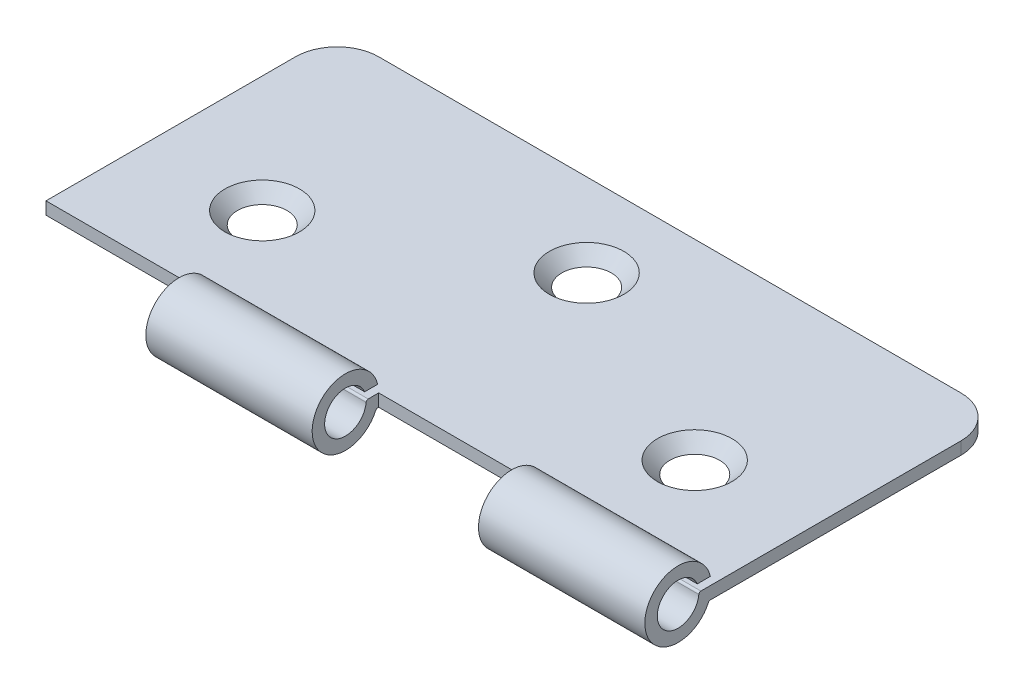
ISO-10303-21;
HEADER;
FILE_DESCRIPTION(('STEP AP214'),'2;1');
FILE_NAME('part.step','',(''),(''),'','','');
FILE_SCHEMA(('AUTOMOTIVE_DESIGN { 1 0 10303 214 1 1 1 1 }'));
ENDSEC;
DATA;
#1=APPLICATION_CONTEXT('core data for automotive mechanical design processes');
#2=APPLICATION_PROTOCOL_DEFINITION('international standard','automotive_design',2000,#1);
#3=PRODUCT_CONTEXT('',#1,'mechanical');
#4=PRODUCT('Part','Part','',(#3));
#5=PRODUCT_RELATED_PRODUCT_CATEGORY('part','',(#4));
#6=PRODUCT_DEFINITION_FORMATION('','',#4);
#7=PRODUCT_DEFINITION_CONTEXT('part definition',#1,'design');
#8=PRODUCT_DEFINITION('design','',#6,#7);
#9=PRODUCT_DEFINITION_SHAPE('','',#8);
#10=(LENGTH_UNIT() NAMED_UNIT(*) SI_UNIT(.MILLI.,.METRE.));
#11=(NAMED_UNIT(*) PLANE_ANGLE_UNIT() SI_UNIT($,.RADIAN.));
#12=(NAMED_UNIT(*) SI_UNIT($,.STERADIAN.) SOLID_ANGLE_UNIT());
#13=UNCERTAINTY_MEASURE_WITH_UNIT(LENGTH_MEASURE(1.E-05),#10,'distance_accuracy_value','');
#14=(GEOMETRIC_REPRESENTATION_CONTEXT(3) GLOBAL_UNCERTAINTY_ASSIGNED_CONTEXT((#13)) GLOBAL_UNIT_ASSIGNED_CONTEXT((#10,
#11,#12)) REPRESENTATION_CONTEXT('',''));
#15=CARTESIAN_POINT('',(0.,0.,0.));
#16=DIRECTION('',(0.,0.,1.));
#17=DIRECTION('',(1.,0.,0.));
#18=AXIS2_PLACEMENT_3D('',#15,#16,#17);
#19=CARTESIAN_POINT('',(-40.,1.5,17.5));
#20=DIRECTION('',(0.,0.,-1.));
#21=DIRECTION('',(-1.,0.,0.));
#22=AXIS2_PLACEMENT_3D('',#19,#20,#21);
#23=PLANE('',#22);
#24=DIRECTION('',(0.,1.,0.));
#25=VECTOR('',#24,1.);
#26=CARTESIAN_POINT('',(-20.,0.,17.5));
#27=LINE('',#26,#25);
#28=CARTESIAN_POINT('',(-20.,0.,17.5));
#29=VERTEX_POINT('',#28);
#30=CARTESIAN_POINT('',(-20.,1.5,17.5));
#31=VERTEX_POINT('',#30);
#32=EDGE_CURVE('E65',#29,#31,#27,.T.);
#33=ORIENTED_EDGE('',*,*,#32,.T.);
#34=DIRECTION('',(1.,0.,0.));
#35=VECTOR('',#34,1.);
#36=CARTESIAN_POINT('',(-40.,1.5,17.5));
#37=LINE('',#36,#35);
#38=CARTESIAN_POINT('',(-40.,1.5,17.5));
#39=VERTEX_POINT('',#38);
#40=EDGE_CURVE('E351',#39,#31,#37,.T.);
#41=ORIENTED_EDGE('',*,*,#40,.F.);
#42=DIRECTION('',(0.,-1.,0.));
#43=VECTOR('',#42,1.);
#44=CARTESIAN_POINT('',(-40.,1.5,17.5));
#45=LINE('',#44,#43);
#46=CARTESIAN_POINT('',(-40.,0.,17.5));
#47=VERTEX_POINT('',#46);
#48=EDGE_CURVE('E11',#39,#47,#45,.T.);
#49=ORIENTED_EDGE('',*,*,#48,.T.);
#50=DIRECTION('',(1.,0.,0.));
#51=VECTOR('',#50,1.);
#52=CARTESIAN_POINT('',(-40.,0.,17.5));
#53=LINE('',#52,#51);
#54=EDGE_CURVE('E371',#47,#29,#53,.T.);
#55=ORIENTED_EDGE('',*,*,#54,.T.);
#56=EDGE_LOOP('',(#33,#41,#49,#55));
#57=FACE_BOUND('',#56,.T.);
#58=ADVANCED_FACE('F39',(#57),#23,.F.);
#59=CARTESIAN_POINT('',(-40.,1.5,17.5));
#60=DIRECTION('',(1.,0.,0.));
#61=DIRECTION('',(0.,0.,-1.));
#62=AXIS2_PLACEMENT_3D('',#59,#60,#61);
#63=PLANE('',#62);
#64=DIRECTION('',(0.,0.,1.));
#65=VECTOR('',#64,1.);
#66=CARTESIAN_POINT('',(-40.,0.,17.5));
#67=LINE('',#66,#65);
#68=CARTESIAN_POINT('',(-40.,0.,-12.5));
#69=VERTEX_POINT('',#68);
#70=EDGE_CURVE('E329',#69,#47,#67,.T.);
#71=ORIENTED_EDGE('',*,*,#70,.T.);
#72=ORIENTED_EDGE('',*,*,#48,.F.);
#73=DIRECTION('',(0.,0.,1.));
#74=VECTOR('',#73,1.);
#75=CARTESIAN_POINT('',(-40.,1.5,17.5));
#76=LINE('',#75,#74);
#77=CARTESIAN_POINT('',(-40.,1.5,-12.5));
#78=VERTEX_POINT('',#77);
#79=EDGE_CURVE('E346',#78,#39,#76,.T.);
#80=ORIENTED_EDGE('',*,*,#79,.F.);
#81=DIRECTION('',(0.,-1.,0.));
#82=VECTOR('',#81,1.);
#83=CARTESIAN_POINT('',(-40.,1.5,-12.5));
#84=LINE('',#83,#82);
#85=EDGE_CURVE('E366',#78,#69,#84,.T.);
#86=ORIENTED_EDGE('',*,*,#85,.T.);
#87=EDGE_LOOP('',(#71,#72,#80,#86));
#88=FACE_BOUND('',#87,.T.);
#89=ADVANCED_FACE('F41',(#88),#63,.F.);
#90=CARTESIAN_POINT('',(0.,1.5,17.5));
#91=VERTEX_POINT('',#90);
#92=CARTESIAN_POINT('',(20.,1.5,17.5));
#93=VERTEX_POINT('',#92);
#94=EDGE_CURVE('E57',#91,#93,#37,.T.);
#95=ORIENTED_EDGE('',*,*,#94,.F.);
#96=DIRECTION('',(0.,1.,0.));
#97=VECTOR('',#96,1.);
#98=CARTESIAN_POINT('',(0.,0.,17.5));
#99=LINE('',#98,#97);
#100=CARTESIAN_POINT('',(0.,0.,17.5));
#101=VERTEX_POINT('',#100);
#102=EDGE_CURVE('E242',#101,#91,#99,.T.);
#103=ORIENTED_EDGE('',*,*,#102,.F.);
#104=CARTESIAN_POINT('',(20.,0.,17.5));
#105=VERTEX_POINT('',#104);
#106=EDGE_CURVE('E370',#101,#105,#53,.T.);
#107=ORIENTED_EDGE('',*,*,#106,.T.);
#108=DIRECTION('',(0.,1.,0.));
#109=VECTOR('',#108,1.);
#110=CARTESIAN_POINT('',(20.,0.,17.5));
#111=LINE('',#110,#109);
#112=EDGE_CURVE('E284',#105,#93,#111,.T.);
#113=ORIENTED_EDGE('',*,*,#112,.T.);
#114=EDGE_LOOP('',(#95,#103,#107,#113));
#115=FACE_BOUND('',#114,.T.);
#116=ADVANCED_FACE('F467',(#115),#23,.F.);
#117=CARTESIAN_POINT('',(40.,1.5,17.5));
#118=DIRECTION('',(-1.,0.,0.));
#119=DIRECTION('',(0.,0.,1.));
#120=AXIS2_PLACEMENT_3D('',#117,#118,#119);
#121=PLANE('',#120);
#122=DIRECTION('',(0.,0.,-1.));
#123=VECTOR('',#122,1.);
#124=CARTESIAN_POINT('',(40.,0.,17.5));
#125=LINE('',#124,#123);
#126=CARTESIAN_POINT('',(40.,0.,17.6270166537926));
#127=VERTEX_POINT('',#126);
#128=CARTESIAN_POINT('',(40.,0.,-12.5));
#129=VERTEX_POINT('',#128);
#130=EDGE_CURVE('E374',#127,#129,#125,.T.);
#131=ORIENTED_EDGE('',*,*,#130,.T.);
#132=DIRECTION('',(0.,-1.,0.));
#133=VECTOR('',#132,1.);
#134=CARTESIAN_POINT('',(40.,1.5,-12.5));
#135=LINE('',#134,#133);
#136=CARTESIAN_POINT('',(40.,1.5,-12.5));
#137=VERTEX_POINT('',#136);
#138=EDGE_CURVE('E49',#137,#129,#135,.T.);
#139=ORIENTED_EDGE('',*,*,#138,.F.);
#140=DIRECTION('',(0.,0.,-1.));
#141=VECTOR('',#140,1.);
#142=CARTESIAN_POINT('',(40.,1.5,17.5));
#143=LINE('',#142,#141);
#144=CARTESIAN_POINT('',(40.,1.5,18.7613872124742));
#145=VERTEX_POINT('',#144);
#146=EDGE_CURVE('E354',#145,#137,#143,.T.);
#147=ORIENTED_EDGE('',*,*,#146,.F.);
#148=CARTESIAN_POINT('',(40.,1.25,18.7613872124742));
#149=DIRECTION('',(1.,0.,0.));
#150=DIRECTION('',(0.,0.,1.));
#151=AXIS2_PLACEMENT_3D('',#148,#149,#150);
#152=CIRCLE('',#151,0.25);
#153=CARTESIAN_POINT('',(40.,1.27272727272727,19.0103520113402));
#154=VERTEX_POINT('',#153);
#155=EDGE_CURVE('E311',#145,#154,#152,.T.);
#156=ORIENTED_EDGE('',*,*,#155,.T.);
#157=CARTESIAN_POINT('',(40.,1.5,21.5));
#158=DIRECTION('',(-1.,0.,0.));
#159=DIRECTION('',(0.,0.,-1.));
#160=AXIS2_PLACEMENT_3D('',#157,#158,#159);
#161=CIRCLE('',#160,2.5);
#162=CARTESIAN_POINT('',(40.,2.45665015011595,19.1902769667592));
#163=VERTEX_POINT('',#162);
#164=EDGE_CURVE('E315',#154,#163,#161,.T.);
#165=ORIENTED_EDGE('',*,*,#164,.T.);
#166=DIRECTION('',(0.,0.,-1.));
#167=VECTOR('',#166,1.);
#168=CARTESIAN_POINT('',(40.,2.45665015011595,17.6160818121022));
#169=LINE('',#168,#167);
#170=CARTESIAN_POINT('',(40.,2.45665015011595,17.6160818121022));
#171=VERTEX_POINT('',#170);
#172=EDGE_CURVE('E319',#163,#171,#169,.T.);
#173=ORIENTED_EDGE('',*,*,#172,.T.);
#174=CARTESIAN_POINT('',(40.,1.5,21.5));
#175=DIRECTION('',(1.,0.,0.));
#176=DIRECTION('',(0.,0.,-1.));
#177=AXIS2_PLACEMENT_3D('',#174,#175,#176);
#178=CIRCLE('',#177,4.);
#179=CARTESIAN_POINT('',(40.,-0.147058823529412,17.8548392035695));
#180=VERTEX_POINT('',#179);
#181=EDGE_CURVE('E280',#171,#180,#178,.T.);
#182=ORIENTED_EDGE('',*,*,#181,.T.);
#183=CARTESIAN_POINT('',(40.,-0.25,17.6270166537926));
#184=DIRECTION('',(-1.,0.,0.));
#185=DIRECTION('',(0.,0.,-1.));
#186=AXIS2_PLACEMENT_3D('',#183,#184,#185);
#187=CIRCLE('',#186,0.25);
#188=EDGE_CURVE('E263',#180,#127,#187,.T.);
#189=ORIENTED_EDGE('',*,*,#188,.T.);
#190=EDGE_LOOP('',(#131,#139,#147,#156,#165,#173,#182,#189));
#191=FACE_BOUND('',#190,.T.);
#192=ADVANCED_FACE('F455',(#191),#121,.F.);
#193=CARTESIAN_POINT('',(35.,1.5,-12.5));
#194=DIRECTION('',(0.,-1.,0.));
#195=DIRECTION('',(0.,0.,-1.));
#196=AXIS2_PLACEMENT_3D('',#193,#194,#195);
#197=CYLINDRICAL_SURFACE('',#196,5.);
#198=CARTESIAN_POINT('',(35.,0.,-12.5));
#199=DIRECTION('',(0.,1.,0.));
#200=DIRECTION('',(0.,0.,-1.));
#201=AXIS2_PLACEMENT_3D('',#198,#199,#200);
#202=CIRCLE('',#201,5.);
#203=CARTESIAN_POINT('',(35.,0.,-17.5));
#204=VERTEX_POINT('',#203);
#205=EDGE_CURVE('E377',#129,#204,#202,.T.);
#206=ORIENTED_EDGE('',*,*,#205,.T.);
#207=DIRECTION('',(0.,-1.,0.));
#208=VECTOR('',#207,1.);
#209=CARTESIAN_POINT('',(35.,1.5,-17.5));
#210=LINE('',#209,#208);
#211=CARTESIAN_POINT('',(35.,1.5,-17.5));
#212=VERTEX_POINT('',#211);
#213=EDGE_CURVE('E392',#212,#204,#210,.T.);
#214=ORIENTED_EDGE('',*,*,#213,.F.);
#215=CARTESIAN_POINT('',(35.,1.5,-12.5));
#216=DIRECTION('',(0.,1.,0.));
#217=DIRECTION('',(0.,0.,-1.));
#218=AXIS2_PLACEMENT_3D('',#215,#216,#217);
#219=CIRCLE('',#218,5.);
#220=EDGE_CURVE('E357',#137,#212,#219,.T.);
#221=ORIENTED_EDGE('',*,*,#220,.F.);
#222=ORIENTED_EDGE('',*,*,#138,.T.);
#223=EDGE_LOOP('',(#206,#214,#221,#222));
#224=FACE_BOUND('',#223,.T.);
#225=ADVANCED_FACE('F447',(#224),#197,.T.);
#226=CARTESIAN_POINT('',(-35.,1.5,-17.5));
#227=DIRECTION('',(0.,0.,1.));
#228=DIRECTION('',(1.,0.,0.));
#229=AXIS2_PLACEMENT_3D('',#226,#227,#228);
#230=PLANE('',#229);
#231=DIRECTION('',(-1.,0.,0.));
#232=VECTOR('',#231,1.);
#233=CARTESIAN_POINT('',(-35.,0.,-17.5));
#234=LINE('',#233,#232);
#235=CARTESIAN_POINT('',(-35.,0.,-17.5));
#236=VERTEX_POINT('',#235);
#237=EDGE_CURVE('E380',#204,#236,#234,.T.);
#238=ORIENTED_EDGE('',*,*,#237,.T.);
#239=DIRECTION('',(0.,-1.,0.));
#240=VECTOR('',#239,1.);
#241=CARTESIAN_POINT('',(-35.,1.5,-17.5));
#242=LINE('',#241,#240);
#243=CARTESIAN_POINT('',(-35.,1.5,-17.5));
#244=VERTEX_POINT('',#243);
#245=EDGE_CURVE('E388',#244,#236,#242,.T.);
#246=ORIENTED_EDGE('',*,*,#245,.F.);
#247=DIRECTION('',(-1.,0.,0.));
#248=VECTOR('',#247,1.);
#249=CARTESIAN_POINT('',(-35.,1.5,-17.5));
#250=LINE('',#249,#248);
#251=EDGE_CURVE('E360',#212,#244,#250,.T.);
#252=ORIENTED_EDGE('',*,*,#251,.F.);
#253=ORIENTED_EDGE('',*,*,#213,.T.);
#254=EDGE_LOOP('',(#238,#246,#252,#253));
#255=FACE_BOUND('',#254,.T.);
#256=ADVANCED_FACE('F443',(#255),#230,.F.);
#257=CARTESIAN_POINT('',(-35.,1.5,-12.5));
#258=DIRECTION('',(0.,-1.,0.));
#259=DIRECTION('',(0.,0.,-1.));
#260=AXIS2_PLACEMENT_3D('',#257,#258,#259);
#261=CYLINDRICAL_SURFACE('',#260,5.);
#262=CARTESIAN_POINT('',(-35.,0.,-12.5));
#263=DIRECTION('',(0.,1.,0.));
#264=DIRECTION('',(0.,0.,1.));
#265=AXIS2_PLACEMENT_3D('',#262,#263,#264);
#266=CIRCLE('',#265,5.);
#267=EDGE_CURVE('E350',#236,#69,#266,.T.);
#268=ORIENTED_EDGE('',*,*,#267,.T.);
#269=ORIENTED_EDGE('',*,*,#85,.F.);
#270=CARTESIAN_POINT('',(-35.,1.5,-12.5));
#271=DIRECTION('',(0.,1.,0.));
#272=DIRECTION('',(0.,0.,1.));
#273=AXIS2_PLACEMENT_3D('',#270,#271,#272);
#274=CIRCLE('',#273,5.);
#275=EDGE_CURVE('E363',#244,#78,#274,.T.);
#276=ORIENTED_EDGE('',*,*,#275,.F.);
#277=ORIENTED_EDGE('',*,*,#245,.T.);
#278=EDGE_LOOP('',(#268,#269,#276,#277));
#279=FACE_BOUND('',#278,.T.);
#280=ADVANCED_FACE('F426',(#279),#261,.T.);
#281=CARTESIAN_POINT('',(-35.,1.5,-12.5));
#282=DIRECTION('',(0.,1.,0.));
#283=DIRECTION('',(0.,0.,1.));
#284=AXIS2_PLACEMENT_3D('',#281,#282,#283);
#285=PLANE('',#284);
#286=CARTESIAN_POINT('',(-26.,1.5,5.5));
#287=DIRECTION('',(0.,1.,0.));
#288=DIRECTION('',(0.,0.,1.));
#289=AXIS2_PLACEMENT_3D('',#286,#287,#288);
#290=CIRCLE('',#289,4.48);
#291=CARTESIAN_POINT('',(-26.,1.5,9.98));
#292=VERTEX_POINT('',#291);
#293=EDGE_CURVE('E414',#292,#292,#290,.T.);
#294=ORIENTED_EDGE('',*,*,#293,.F.);
#295=EDGE_LOOP('',(#294));
#296=FACE_BOUND('',#295,.T.);
#297=CARTESIAN_POINT('',(0.,1.5,-7.5));
#298=DIRECTION('',(0.,1.,0.));
#299=DIRECTION('',(0.,0.,1.));
#300=AXIS2_PLACEMENT_3D('',#297,#298,#299);
#301=CIRCLE('',#300,4.48);
#302=CARTESIAN_POINT('',(0.,1.5,-3.02));
#303=VERTEX_POINT('',#302);
#304=EDGE_CURVE('E402',#303,#303,#301,.T.);
#305=ORIENTED_EDGE('',*,*,#304,.F.);
#306=EDGE_LOOP('',(#305));
#307=FACE_BOUND('',#306,.T.);
#308=CARTESIAN_POINT('',(26.,1.5,5.5));
#309=DIRECTION('',(0.,1.,0.));
#310=DIRECTION('',(0.,0.,1.));
#311=AXIS2_PLACEMENT_3D('',#308,#309,#310);
#312=CIRCLE('',#311,4.48);
#313=CARTESIAN_POINT('',(26.,1.5,9.98));
#314=VERTEX_POINT('',#313);
#315=EDGE_CURVE('E401',#314,#314,#312,.T.);
#316=ORIENTED_EDGE('',*,*,#315,.F.);
#317=EDGE_LOOP('',(#316));
#318=FACE_BOUND('',#317,.T.);
#319=ORIENTED_EDGE('',*,*,#79,.T.);
#320=ORIENTED_EDGE('',*,*,#40,.T.);
#321=DIRECTION('',(0.,0.,1.));
#322=VECTOR('',#321,1.);
#323=CARTESIAN_POINT('',(-20.,1.5,17.5));
#324=LINE('',#323,#322);
#325=CARTESIAN_POINT('',(-20.,1.5,18.7613872124742));
#326=VERTEX_POINT('',#325);
#327=EDGE_CURVE('E219',#31,#326,#324,.T.);
#328=ORIENTED_EDGE('',*,*,#327,.T.);
#329=DIRECTION('',(1.,0.,0.));
#330=VECTOR('',#329,1.);
#331=CARTESIAN_POINT('',(-20.,1.5,18.7613872124742));
#332=LINE('',#331,#330);
#333=CARTESIAN_POINT('',(0.,1.5,18.7613872124742));
#334=VERTEX_POINT('',#333);
#335=EDGE_CURVE('E192',#326,#334,#332,.T.);
#336=ORIENTED_EDGE('',*,*,#335,.T.);
#337=DIRECTION('',(0.,0.,1.));
#338=VECTOR('',#337,1.);
#339=CARTESIAN_POINT('',(0.,1.5,17.5));
#340=LINE('',#339,#338);
#341=EDGE_CURVE('E246',#91,#334,#340,.T.);
#342=ORIENTED_EDGE('',*,*,#341,.F.);
#343=ORIENTED_EDGE('',*,*,#94,.T.);
#344=DIRECTION('',(0.,0.,1.));
#345=VECTOR('',#344,1.);
#346=CARTESIAN_POINT('',(20.,1.5,17.5));
#347=LINE('',#346,#345);
#348=CARTESIAN_POINT('',(20.,1.5,18.7613872124742));
#349=VERTEX_POINT('',#348);
#350=EDGE_CURVE('E287',#93,#349,#347,.T.);
#351=ORIENTED_EDGE('',*,*,#350,.T.);
#352=DIRECTION('',(1.,0.,0.));
#353=VECTOR('',#352,1.);
#354=CARTESIAN_POINT('',(20.,1.5,18.7613872124742));
#355=LINE('',#354,#353);
#356=EDGE_CURVE('E339',#349,#145,#355,.T.);
#357=ORIENTED_EDGE('',*,*,#356,.T.);
#358=ORIENTED_EDGE('',*,*,#146,.T.);
#359=ORIENTED_EDGE('',*,*,#220,.T.);
#360=ORIENTED_EDGE('',*,*,#251,.T.);
#361=ORIENTED_EDGE('',*,*,#275,.T.);
#362=EDGE_LOOP('',(#319,#320,#328,#336,#342,#343,#351,#357,#358,#359,#360,#361));
#363=FACE_BOUND('',#362,.T.);
#364=ADVANCED_FACE('F423',(#296,#307,#318,#363),#285,.T.);
#365=CARTESIAN_POINT('',(-35.,0.,-12.5));
#366=DIRECTION('',(0.,1.,0.));
#367=DIRECTION('',(0.,0.,1.));
#368=AXIS2_PLACEMENT_3D('',#365,#366,#367);
#369=PLANE('',#368);
#370=CARTESIAN_POINT('',(-26.,0.,5.5));
#371=DIRECTION('',(0.,1.,0.));
#372=DIRECTION('',(0.,0.,1.));
#373=AXIS2_PLACEMENT_3D('',#370,#371,#372);
#374=CIRCLE('',#373,2.98);
#375=CARTESIAN_POINT('',(-26.,0.,8.48));
#376=VERTEX_POINT('',#375);
#377=EDGE_CURVE('E43',#376,#376,#374,.T.);
#378=ORIENTED_EDGE('',*,*,#377,.T.);
#379=EDGE_LOOP('',(#378));
#380=FACE_BOUND('',#379,.T.);
#381=CARTESIAN_POINT('',(0.,0.,-7.5));
#382=DIRECTION('',(0.,1.,0.));
#383=DIRECTION('',(0.,0.,1.));
#384=AXIS2_PLACEMENT_3D('',#381,#382,#383);
#385=CIRCLE('',#384,2.98);
#386=CARTESIAN_POINT('',(0.,0.,-4.52));
#387=VERTEX_POINT('',#386);
#388=EDGE_CURVE('E398',#387,#387,#385,.T.);
#389=ORIENTED_EDGE('',*,*,#388,.T.);
#390=EDGE_LOOP('',(#389));
#391=FACE_BOUND('',#390,.T.);
#392=CARTESIAN_POINT('',(26.,0.,5.5));
#393=DIRECTION('',(0.,1.,0.));
#394=DIRECTION('',(0.,0.,1.));
#395=AXIS2_PLACEMENT_3D('',#392,#393,#394);
#396=CIRCLE('',#395,2.98);
#397=CARTESIAN_POINT('',(26.,0.,8.48));
#398=VERTEX_POINT('',#397);
#399=EDGE_CURVE('E214',#398,#398,#396,.T.);
#400=ORIENTED_EDGE('',*,*,#399,.T.);
#401=EDGE_LOOP('',(#400));
#402=FACE_BOUND('',#401,.T.);
#403=ORIENTED_EDGE('',*,*,#70,.F.);
#404=ORIENTED_EDGE('',*,*,#267,.F.);
#405=ORIENTED_EDGE('',*,*,#237,.F.);
#406=ORIENTED_EDGE('',*,*,#205,.F.);
#407=ORIENTED_EDGE('',*,*,#130,.F.);
#408=DIRECTION('',(1.,0.,0.));
#409=VECTOR('',#408,1.);
#410=CARTESIAN_POINT('',(20.,0.,17.6270166537926));
#411=LINE('',#410,#409);
#412=CARTESIAN_POINT('',(20.,0.,17.6270166537926));
#413=VERTEX_POINT('',#412);
#414=EDGE_CURVE('E307',#413,#127,#411,.T.);
#415=ORIENTED_EDGE('',*,*,#414,.F.);
#416=DIRECTION('',(0.,0.,-1.));
#417=VECTOR('',#416,1.);
#418=CARTESIAN_POINT('',(20.,0.,17.6270166537926));
#419=LINE('',#418,#417);
#420=EDGE_CURVE('E279',#413,#105,#419,.T.);
#421=ORIENTED_EDGE('',*,*,#420,.T.);
#422=ORIENTED_EDGE('',*,*,#106,.F.);
#423=DIRECTION('',(0.,0.,-1.));
#424=VECTOR('',#423,1.);
#425=CARTESIAN_POINT('',(0.,0.,17.6270166537926));
#426=LINE('',#425,#424);
#427=CARTESIAN_POINT('',(0.,0.,17.6270166537926));
#428=VERTEX_POINT('',#427);
#429=EDGE_CURVE('E186',#428,#101,#426,.T.);
#430=ORIENTED_EDGE('',*,*,#429,.F.);
#431=DIRECTION('',(1.,0.,0.));
#432=VECTOR('',#431,1.);
#433=CARTESIAN_POINT('',(-20.,0.,17.6270166537926));
#434=LINE('',#433,#432);
#435=CARTESIAN_POINT('',(-20.,0.,17.6270166537926));
#436=VERTEX_POINT('',#435);
#437=EDGE_CURVE('E180',#436,#428,#434,.T.);
#438=ORIENTED_EDGE('',*,*,#437,.F.);
#439=DIRECTION('',(0.,0.,-1.));
#440=VECTOR('',#439,1.);
#441=CARTESIAN_POINT('',(-20.,0.,17.6270166537926));
#442=LINE('',#441,#440);
#443=EDGE_CURVE('E184',#436,#29,#442,.T.);
#444=ORIENTED_EDGE('',*,*,#443,.T.);
#445=ORIENTED_EDGE('',*,*,#54,.F.);
#446=EDGE_LOOP('',(#403,#404,#405,#406,#407,#415,#421,#422,#430,#438,#444,#445));
#447=FACE_BOUND('',#446,.T.);
#448=ADVANCED_FACE('F183',(#380,#391,#402,#447),#369,.F.);
#449=CARTESIAN_POINT('',(20.,-0.25,17.6270166537926));
#450=DIRECTION('',(1.,0.,0.));
#451=DIRECTION('',(0.,0.,-1.));
#452=AXIS2_PLACEMENT_3D('',#449,#450,#451);
#453=CYLINDRICAL_SURFACE('',#452,0.25);
#454=ORIENTED_EDGE('',*,*,#188,.F.);
#455=DIRECTION('',(1.,0.,0.));
#456=VECTOR('',#455,1.);
#457=CARTESIAN_POINT('',(20.,-0.147058823529412,17.8548392035695));
#458=LINE('',#457,#456);
#459=CARTESIAN_POINT('',(20.,-0.147058823529412,17.8548392035695));
#460=VERTEX_POINT('',#459);
#461=EDGE_CURVE('E326',#460,#180,#458,.T.);
#462=ORIENTED_EDGE('',*,*,#461,.F.);
#463=CARTESIAN_POINT('',(20.,-0.25,17.6270166537926));
#464=DIRECTION('',(-1.,0.,0.));
#465=DIRECTION('',(0.,0.,-1.));
#466=AXIS2_PLACEMENT_3D('',#463,#464,#465);
#467=CIRCLE('',#466,0.25);
#468=EDGE_CURVE('E275',#460,#413,#467,.T.);
#469=ORIENTED_EDGE('',*,*,#468,.T.);
#470=ORIENTED_EDGE('',*,*,#414,.T.);
#471=EDGE_LOOP('',(#454,#462,#469,#470));
#472=FACE_BOUND('',#471,.T.);
#473=ADVANCED_FACE('F453',(#472),#453,.F.);
#474=CARTESIAN_POINT('',(20.,1.5,21.5));
#475=DIRECTION('',(1.,0.,0.));
#476=DIRECTION('',(0.,0.,-1.));
#477=AXIS2_PLACEMENT_3D('',#474,#475,#476);
#478=CYLINDRICAL_SURFACE('',#477,4.);
#479=ORIENTED_EDGE('',*,*,#181,.F.);
#480=DIRECTION('',(1.,0.,0.));
#481=VECTOR('',#480,1.);
#482=CARTESIAN_POINT('',(20.,2.45665015011595,17.6160818121022));
#483=LINE('',#482,#481);
#484=CARTESIAN_POINT('',(20.,2.45665015011595,17.6160818121022));
#485=VERTEX_POINT('',#484);
#486=EDGE_CURVE('E330',#485,#171,#483,.T.);
#487=ORIENTED_EDGE('',*,*,#486,.F.);
#488=CARTESIAN_POINT('',(20.,1.5,21.5));
#489=DIRECTION('',(1.,0.,0.));
#490=DIRECTION('',(0.,0.,-1.));
#491=AXIS2_PLACEMENT_3D('',#488,#489,#490);
#492=CIRCLE('',#491,4.);
#493=EDGE_CURVE('E303',#485,#460,#492,.T.);
#494=ORIENTED_EDGE('',*,*,#493,.T.);
#495=ORIENTED_EDGE('',*,*,#461,.T.);
#496=EDGE_LOOP('',(#479,#487,#494,#495));
#497=FACE_BOUND('',#496,.T.);
#498=ADVANCED_FACE('F459',(#497),#478,.T.);
#499=CARTESIAN_POINT('',(20.,2.45665015011595,17.6160818121022));
#500=DIRECTION('',(0.,-1.,0.));
#501=DIRECTION('',(0.,0.,-1.));
#502=AXIS2_PLACEMENT_3D('',#499,#500,#501);
#503=PLANE('',#502);
#504=ORIENTED_EDGE('',*,*,#172,.F.);
#505=DIRECTION('',(1.,0.,0.));
#506=VECTOR('',#505,1.);
#507=CARTESIAN_POINT('',(20.,2.45665015011595,19.1902769667592));
#508=LINE('',#507,#506);
#509=CARTESIAN_POINT('',(20.,2.45665015011595,19.1902769667592));
#510=VERTEX_POINT('',#509);
#511=EDGE_CURVE('E333',#510,#163,#508,.T.);
#512=ORIENTED_EDGE('',*,*,#511,.F.);
#513=DIRECTION('',(0.,0.,-1.));
#514=VECTOR('',#513,1.);
#515=CARTESIAN_POINT('',(20.,2.45665015011595,17.6160818121022));
#516=LINE('',#515,#514);
#517=EDGE_CURVE('E299',#510,#485,#516,.T.);
#518=ORIENTED_EDGE('',*,*,#517,.T.);
#519=ORIENTED_EDGE('',*,*,#486,.T.);
#520=EDGE_LOOP('',(#504,#512,#518,#519));
#521=FACE_BOUND('',#520,.T.);
#522=ADVANCED_FACE('F494',(#521),#503,.T.);
#523=CARTESIAN_POINT('',(20.,1.5,21.5));
#524=DIRECTION('',(1.,0.,0.));
#525=DIRECTION('',(0.,0.,-1.));
#526=AXIS2_PLACEMENT_3D('',#523,#524,#525);
#527=CYLINDRICAL_SURFACE('',#526,2.5);
#528=ORIENTED_EDGE('',*,*,#164,.F.);
#529=DIRECTION('',(1.,0.,0.));
#530=VECTOR('',#529,1.);
#531=CARTESIAN_POINT('',(20.,1.27272727272727,19.0103520113402));
#532=LINE('',#531,#530);
#533=CARTESIAN_POINT('',(20.,1.27272727272727,19.0103520113402));
#534=VERTEX_POINT('',#533);
#535=EDGE_CURVE('E336',#534,#154,#532,.T.);
#536=ORIENTED_EDGE('',*,*,#535,.F.);
#537=CARTESIAN_POINT('',(20.,1.5,21.5));
#538=DIRECTION('',(-1.,0.,0.));
#539=DIRECTION('',(0.,0.,-1.));
#540=AXIS2_PLACEMENT_3D('',#537,#538,#539);
#541=CIRCLE('',#540,2.5);
#542=EDGE_CURVE('E295',#534,#510,#541,.T.);
#543=ORIENTED_EDGE('',*,*,#542,.T.);
#544=ORIENTED_EDGE('',*,*,#511,.T.);
#545=EDGE_LOOP('',(#528,#536,#543,#544));
#546=FACE_BOUND('',#545,.T.);
#547=ADVANCED_FACE('F492',(#546),#527,.F.);
#548=CARTESIAN_POINT('',(20.,1.25,18.7613872124742));
#549=DIRECTION('',(1.,0.,0.));
#550=DIRECTION('',(0.,0.,-1.));
#551=AXIS2_PLACEMENT_3D('',#548,#549,#550);
#552=CYLINDRICAL_SURFACE('',#551,0.25);
#553=ORIENTED_EDGE('',*,*,#155,.F.);
#554=ORIENTED_EDGE('',*,*,#356,.F.);
#555=CARTESIAN_POINT('',(20.,1.25,18.7613872124742));
#556=DIRECTION('',(1.,0.,0.));
#557=DIRECTION('',(0.,0.,1.));
#558=AXIS2_PLACEMENT_3D('',#555,#556,#557);
#559=CIRCLE('',#558,0.25);
#560=EDGE_CURVE('E291',#349,#534,#559,.T.);
#561=ORIENTED_EDGE('',*,*,#560,.T.);
#562=ORIENTED_EDGE('',*,*,#535,.T.);
#563=EDGE_LOOP('',(#553,#554,#561,#562));
#564=FACE_BOUND('',#563,.T.);
#565=ADVANCED_FACE('F489',(#564),#552,.T.);
#566=CARTESIAN_POINT('',(20.,-0.25,17.6270166537926));
#567=DIRECTION('',(1.,0.,0.));
#568=DIRECTION('',(0.,0.,-1.));
#569=AXIS2_PLACEMENT_3D('',#566,#567,#568);
#570=PLANE('',#569);
#571=ORIENTED_EDGE('',*,*,#468,.F.);
#572=ORIENTED_EDGE('',*,*,#493,.F.);
#573=ORIENTED_EDGE('',*,*,#517,.F.);
#574=ORIENTED_EDGE('',*,*,#542,.F.);
#575=ORIENTED_EDGE('',*,*,#560,.F.);
#576=ORIENTED_EDGE('',*,*,#350,.F.);
#577=ORIENTED_EDGE('',*,*,#112,.F.);
#578=ORIENTED_EDGE('',*,*,#420,.F.);
#579=EDGE_LOOP('',(#571,#572,#573,#574,#575,#576,#577,#578));
#580=FACE_BOUND('',#579,.T.);
#581=ADVANCED_FACE('F462',(#580),#570,.F.);
#582=CARTESIAN_POINT('',(-20.,-0.25,17.6270166537926));
#583=DIRECTION('',(1.,0.,0.));
#584=DIRECTION('',(0.,0.,-1.));
#585=AXIS2_PLACEMENT_3D('',#582,#583,#584);
#586=CYLINDRICAL_SURFACE('',#585,0.25);
#587=CARTESIAN_POINT('',(0.,-0.25,17.6270166537926));
#588=DIRECTION('',(-1.,0.,0.));
#589=DIRECTION('',(0.,0.,-1.));
#590=AXIS2_PLACEMENT_3D('',#587,#588,#589);
#591=CIRCLE('',#590,0.25);
#592=CARTESIAN_POINT('',(0.,-0.147058823529412,17.8548392035695));
#593=VERTEX_POINT('',#592);
#594=EDGE_CURVE('E237',#593,#428,#591,.T.);
#595=ORIENTED_EDGE('',*,*,#594,.F.);
#596=DIRECTION('',(1.,0.,0.));
#597=VECTOR('',#596,1.);
#598=CARTESIAN_POINT('',(-20.,-0.147058823529412,17.8548392035695));
#599=LINE('',#598,#597);
#600=CARTESIAN_POINT('',(-20.,-0.147058823529412,17.8548392035695));
#601=VERTEX_POINT('',#600);
#602=EDGE_CURVE('E205',#601,#593,#599,.T.);
#603=ORIENTED_EDGE('',*,*,#602,.F.);
#604=CARTESIAN_POINT('',(-20.,-0.25,17.6270166537926));
#605=DIRECTION('',(-1.,0.,0.));
#606=DIRECTION('',(0.,0.,-1.));
#607=AXIS2_PLACEMENT_3D('',#604,#605,#606);
#608=CIRCLE('',#607,0.25);
#609=EDGE_CURVE('E199',#601,#436,#608,.T.);
#610=ORIENTED_EDGE('',*,*,#609,.T.);
#611=ORIENTED_EDGE('',*,*,#437,.T.);
#612=EDGE_LOOP('',(#595,#603,#610,#611));
#613=FACE_BOUND('',#612,.T.);
#614=ADVANCED_FACE('F204',(#613),#586,.F.);
#615=CARTESIAN_POINT('',(-20.,1.5,21.5));
#616=DIRECTION('',(1.,0.,0.));
#617=DIRECTION('',(0.,0.,-1.));
#618=AXIS2_PLACEMENT_3D('',#615,#616,#617);
#619=CYLINDRICAL_SURFACE('',#618,4.);
#620=CARTESIAN_POINT('',(0.,1.5,21.5));
#621=DIRECTION('',(1.,0.,0.));
#622=DIRECTION('',(0.,0.,-1.));
#623=AXIS2_PLACEMENT_3D('',#620,#621,#622);
#624=CIRCLE('',#623,4.);
#625=CARTESIAN_POINT('',(0.,2.45665015011595,17.6160818121022));
#626=VERTEX_POINT('',#625);
#627=EDGE_CURVE('E207',#626,#593,#624,.T.);
#628=ORIENTED_EDGE('',*,*,#627,.F.);
#629=DIRECTION('',(1.,0.,0.));
#630=VECTOR('',#629,1.);
#631=CARTESIAN_POINT('',(-20.,2.45665015011595,17.6160818121022));
#632=LINE('',#631,#630);
#633=CARTESIAN_POINT('',(-20.,2.45665015011595,17.6160818121022));
#634=VERTEX_POINT('',#633);
#635=EDGE_CURVE('E264',#634,#626,#632,.T.);
#636=ORIENTED_EDGE('',*,*,#635,.F.);
#637=CARTESIAN_POINT('',(-20.,1.5,21.5));
#638=DIRECTION('',(1.,0.,0.));
#639=DIRECTION('',(0.,0.,-1.));
#640=AXIS2_PLACEMENT_3D('',#637,#638,#639);
#641=CIRCLE('',#640,4.);
#642=EDGE_CURVE('E193',#634,#601,#641,.T.);
#643=ORIENTED_EDGE('',*,*,#642,.T.);
#644=ORIENTED_EDGE('',*,*,#602,.T.);
#645=EDGE_LOOP('',(#628,#636,#643,#644));
#646=FACE_BOUND('',#645,.T.);
#647=ADVANCED_FACE('F473',(#646),#619,.T.);
#648=CARTESIAN_POINT('',(-20.,2.45665015011595,17.6160818121022));
#649=DIRECTION('',(0.,-1.,0.));
#650=DIRECTION('',(0.,0.,-1.));
#651=AXIS2_PLACEMENT_3D('',#648,#649,#650);
#652=PLANE('',#651);
#653=DIRECTION('',(0.,0.,-1.));
#654=VECTOR('',#653,1.);
#655=CARTESIAN_POINT('',(0.,2.45665015011595,17.6160818121022));
#656=LINE('',#655,#654);
#657=CARTESIAN_POINT('',(0.,2.45665015011595,19.1902769667592));
#658=VERTEX_POINT('',#657);
#659=EDGE_CURVE('E211',#658,#626,#656,.T.);
#660=ORIENTED_EDGE('',*,*,#659,.F.);
#661=DIRECTION('',(1.,0.,0.));
#662=VECTOR('',#661,1.);
#663=CARTESIAN_POINT('',(-20.,2.45665015011595,19.1902769667592));
#664=LINE('',#663,#662);
#665=CARTESIAN_POINT('',(-20.,2.45665015011595,19.1902769667592));
#666=VERTEX_POINT('',#665);
#667=EDGE_CURVE('E267',#666,#658,#664,.T.);
#668=ORIENTED_EDGE('',*,*,#667,.F.);
#669=DIRECTION('',(0.,0.,-1.));
#670=VECTOR('',#669,1.);
#671=CARTESIAN_POINT('',(-20.,2.45665015011595,17.6160818121022));
#672=LINE('',#671,#670);
#673=EDGE_CURVE('E231',#666,#634,#672,.T.);
#674=ORIENTED_EDGE('',*,*,#673,.T.);
#675=ORIENTED_EDGE('',*,*,#635,.T.);
#676=EDGE_LOOP('',(#660,#668,#674,#675));
#677=FACE_BOUND('',#676,.T.);
#678=ADVANCED_FACE('F540',(#677),#652,.T.);
#679=CARTESIAN_POINT('',(-20.,1.5,21.5));
#680=DIRECTION('',(1.,0.,0.));
#681=DIRECTION('',(0.,0.,-1.));
#682=AXIS2_PLACEMENT_3D('',#679,#680,#681);
#683=CYLINDRICAL_SURFACE('',#682,2.5);
#684=CARTESIAN_POINT('',(0.,1.5,21.5));
#685=DIRECTION('',(-1.,0.,0.));
#686=DIRECTION('',(0.,0.,-1.));
#687=AXIS2_PLACEMENT_3D('',#684,#685,#686);
#688=CIRCLE('',#687,2.5);
#689=CARTESIAN_POINT('',(0.,1.27272727272727,19.0103520113402));
#690=VERTEX_POINT('',#689);
#691=EDGE_CURVE('E254',#690,#658,#688,.T.);
#692=ORIENTED_EDGE('',*,*,#691,.F.);
#693=DIRECTION('',(1.,0.,0.));
#694=VECTOR('',#693,1.);
#695=CARTESIAN_POINT('',(-20.,1.27272727272727,19.0103520113402));
#696=LINE('',#695,#694);
#697=CARTESIAN_POINT('',(-20.,1.27272727272727,19.0103520113402));
#698=VERTEX_POINT('',#697);
#699=EDGE_CURVE('E270',#698,#690,#696,.T.);
#700=ORIENTED_EDGE('',*,*,#699,.F.);
#701=CARTESIAN_POINT('',(-20.,1.5,21.5));
#702=DIRECTION('',(-1.,0.,0.));
#703=DIRECTION('',(0.,0.,-1.));
#704=AXIS2_PLACEMENT_3D('',#701,#702,#703);
#705=CIRCLE('',#704,2.5);
#706=EDGE_CURVE('E227',#698,#666,#705,.T.);
#707=ORIENTED_EDGE('',*,*,#706,.T.);
#708=ORIENTED_EDGE('',*,*,#667,.T.);
#709=EDGE_LOOP('',(#692,#700,#707,#708));
#710=FACE_BOUND('',#709,.T.);
#711=ADVANCED_FACE('F480',(#710),#683,.F.);
#712=CARTESIAN_POINT('',(-20.,1.25,18.7613872124742));
#713=DIRECTION('',(1.,0.,0.));
#714=DIRECTION('',(0.,0.,-1.));
#715=AXIS2_PLACEMENT_3D('',#712,#713,#714);
#716=CYLINDRICAL_SURFACE('',#715,0.25);
#717=CARTESIAN_POINT('',(0.,1.25,18.7613872124742));
#718=DIRECTION('',(1.,0.,0.));
#719=DIRECTION('',(0.,0.,1.));
#720=AXIS2_PLACEMENT_3D('',#717,#718,#719);
#721=CIRCLE('',#720,0.25);
#722=EDGE_CURVE('E250',#334,#690,#721,.T.);
#723=ORIENTED_EDGE('',*,*,#722,.F.);
#724=ORIENTED_EDGE('',*,*,#335,.F.);
#725=CARTESIAN_POINT('',(-20.,1.25,18.7613872124742));
#726=DIRECTION('',(1.,0.,0.));
#727=DIRECTION('',(0.,0.,1.));
#728=AXIS2_PLACEMENT_3D('',#725,#726,#727);
#729=CIRCLE('',#728,0.25);
#730=EDGE_CURVE('E223',#326,#698,#729,.T.);
#731=ORIENTED_EDGE('',*,*,#730,.T.);
#732=ORIENTED_EDGE('',*,*,#699,.T.);
#733=EDGE_LOOP('',(#723,#724,#731,#732));
#734=FACE_BOUND('',#733,.T.);
#735=ADVANCED_FACE('F483',(#734),#716,.T.);
#736=CARTESIAN_POINT('',(-20.,-0.25,17.6270166537926));
#737=DIRECTION('',(1.,0.,0.));
#738=DIRECTION('',(0.,0.,-1.));
#739=AXIS2_PLACEMENT_3D('',#736,#737,#738);
#740=PLANE('',#739);
#741=ORIENTED_EDGE('',*,*,#609,.F.);
#742=ORIENTED_EDGE('',*,*,#642,.F.);
#743=ORIENTED_EDGE('',*,*,#673,.F.);
#744=ORIENTED_EDGE('',*,*,#706,.F.);
#745=ORIENTED_EDGE('',*,*,#730,.F.);
#746=ORIENTED_EDGE('',*,*,#327,.F.);
#747=ORIENTED_EDGE('',*,*,#32,.F.);
#748=ORIENTED_EDGE('',*,*,#443,.F.);
#749=EDGE_LOOP('',(#741,#742,#743,#744,#745,#746,#747,#748));
#750=FACE_BOUND('',#749,.T.);
#751=ADVANCED_FACE('F197',(#750),#740,.F.);
#752=CARTESIAN_POINT('',(0.,-0.25,17.6270166537926));
#753=DIRECTION('',(1.,0.,0.));
#754=DIRECTION('',(0.,0.,-1.));
#755=AXIS2_PLACEMENT_3D('',#752,#753,#754);
#756=PLANE('',#755);
#757=ORIENTED_EDGE('',*,*,#594,.T.);
#758=ORIENTED_EDGE('',*,*,#429,.T.);
#759=ORIENTED_EDGE('',*,*,#102,.T.);
#760=ORIENTED_EDGE('',*,*,#341,.T.);
#761=ORIENTED_EDGE('',*,*,#722,.T.);
#762=ORIENTED_EDGE('',*,*,#691,.T.);
#763=ORIENTED_EDGE('',*,*,#659,.T.);
#764=ORIENTED_EDGE('',*,*,#627,.T.);
#765=EDGE_LOOP('',(#757,#758,#759,#760,#761,#762,#763,#764));
#766=FACE_BOUND('',#765,.T.);
#767=ADVANCED_FACE('F469',(#766),#756,.T.);
#768=CARTESIAN_POINT('',(26.,1.5,5.5));
#769=DIRECTION('',(0.,1.,0.));
#770=DIRECTION('',(0.,0.,1.));
#771=AXIS2_PLACEMENT_3D('',#768,#769,#770);
#772=CONICAL_SURFACE('',#771,4.48,0.785398163397449);
#773=ORIENTED_EDGE('',*,*,#315,.T.);
#774=EDGE_LOOP('',(#773));
#775=FACE_BOUND('',#774,.T.);
#776=ORIENTED_EDGE('',*,*,#399,.F.);
#777=EDGE_LOOP('',(#776));
#778=FACE_BOUND('',#777,.T.);
#779=ADVANCED_FACE('F547',(#775,#778),#772,.F.);
#780=CARTESIAN_POINT('',(0.,1.5,-7.5));
#781=DIRECTION('',(0.,1.,0.));
#782=DIRECTION('',(0.,0.,1.));
#783=AXIS2_PLACEMENT_3D('',#780,#781,#782);
#784=CONICAL_SURFACE('',#783,4.48,0.785398163397448);
#785=ORIENTED_EDGE('',*,*,#304,.T.);
#786=EDGE_LOOP('',(#785));
#787=FACE_BOUND('',#786,.T.);
#788=ORIENTED_EDGE('',*,*,#388,.F.);
#789=EDGE_LOOP('',(#788));
#790=FACE_BOUND('',#789,.T.);
#791=ADVANCED_FACE('F552',(#787,#790),#784,.F.);
#792=CARTESIAN_POINT('',(-26.,1.5,5.5));
#793=DIRECTION('',(0.,1.,0.));
#794=DIRECTION('',(0.,0.,1.));
#795=AXIS2_PLACEMENT_3D('',#792,#793,#794);
#796=CONICAL_SURFACE('',#795,4.48,0.785398163397449);
#797=ORIENTED_EDGE('',*,*,#293,.T.);
#798=EDGE_LOOP('',(#797));
#799=FACE_BOUND('',#798,.T.);
#800=ORIENTED_EDGE('',*,*,#377,.F.);
#801=EDGE_LOOP('',(#800));
#802=FACE_BOUND('',#801,.T.);
#803=ADVANCED_FACE('F420',(#799,#802),#796,.F.);
#804=CLOSED_SHELL('',(#58,#89,#116,#192,#225,#256,#280,#364,#448,#473,#498,#522,#547,#565,#581,
#614,#647,#678,#711,#735,#751,#767,#779,#791,#803));
#805=MANIFOLD_SOLID_BREP('B2',#804);
#806=ADVANCED_BREP_SHAPE_REPRESENTATION('',(#18,#805),#14);
#807=SHAPE_DEFINITION_REPRESENTATION(#9,#806);
ENDSEC;
END-ISO-10303-21;
